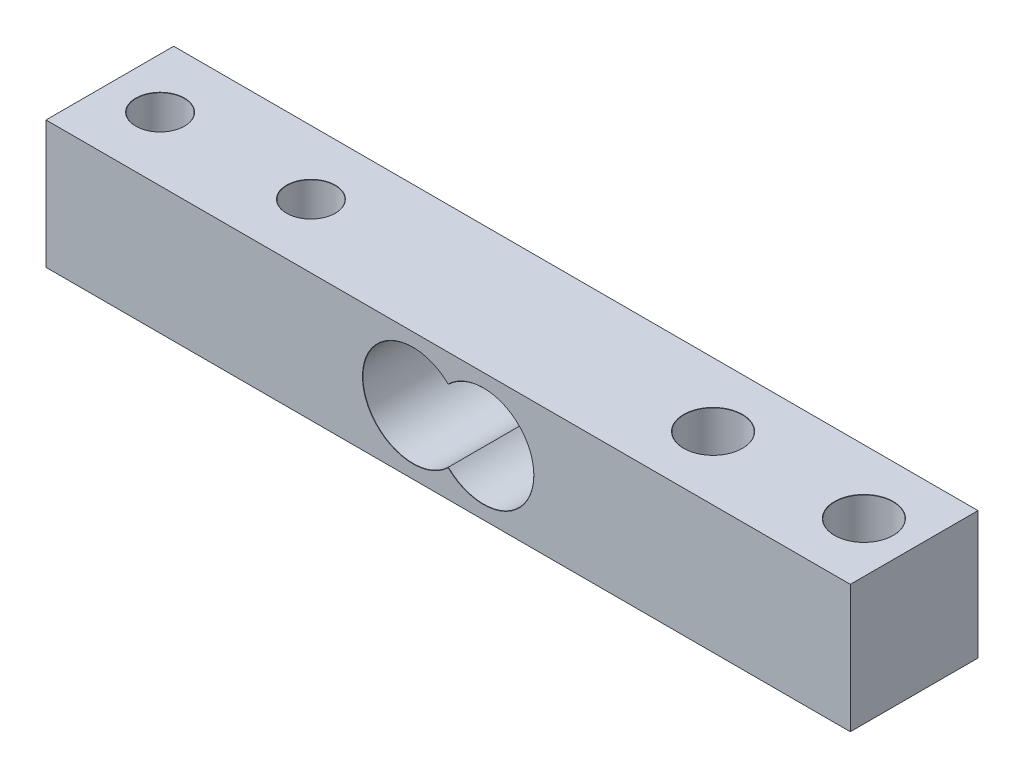
ISO-10303-21;
HEADER;
FILE_DESCRIPTION(('STEP AP214'),'2;1');
FILE_NAME('part.step','',(''),(''),'','','');
FILE_SCHEMA(('AUTOMOTIVE_DESIGN { 1 0 10303 214 1 1 1 1 }'));
ENDSEC;
DATA;
#1=APPLICATION_CONTEXT('core data for automotive mechanical design processes');
#2=APPLICATION_PROTOCOL_DEFINITION('international standard','automotive_design',2000,#1);
#3=PRODUCT_CONTEXT('',#1,'mechanical');
#4=PRODUCT('Part','Part','',(#3));
#5=PRODUCT_RELATED_PRODUCT_CATEGORY('part','',(#4));
#6=PRODUCT_DEFINITION_FORMATION('','',#4);
#7=PRODUCT_DEFINITION_CONTEXT('part definition',#1,'design');
#8=PRODUCT_DEFINITION('design','',#6,#7);
#9=PRODUCT_DEFINITION_SHAPE('','',#8);
#10=(LENGTH_UNIT() NAMED_UNIT(*) SI_UNIT(.MILLI.,.METRE.));
#11=(NAMED_UNIT(*) PLANE_ANGLE_UNIT() SI_UNIT($,.RADIAN.));
#12=(NAMED_UNIT(*) SI_UNIT($,.STERADIAN.) SOLID_ANGLE_UNIT());
#13=UNCERTAINTY_MEASURE_WITH_UNIT(LENGTH_MEASURE(1.E-05),#10,'distance_accuracy_value','');
#14=(GEOMETRIC_REPRESENTATION_CONTEXT(3) GLOBAL_UNCERTAINTY_ASSIGNED_CONTEXT((#13)) GLOBAL_UNIT_ASSIGNED_CONTEXT((#10,
#11,#12)) REPRESENTATION_CONTEXT('',''));
#15=CARTESIAN_POINT('',(0.,0.,0.));
#16=DIRECTION('',(0.,0.,1.));
#17=DIRECTION('',(1.,0.,0.));
#18=AXIS2_PLACEMENT_3D('',#15,#16,#17);
#19=CARTESIAN_POINT('',(40.,12.7,6.35));
#20=DIRECTION('',(-1.,0.,0.));
#21=DIRECTION('',(0.,0.,1.));
#22=AXIS2_PLACEMENT_3D('',#19,#20,#21);
#23=PLANE('',#22);
#24=DIRECTION('',(0.,0.,-1.));
#25=VECTOR('',#24,1.);
#26=CARTESIAN_POINT('',(40.,0.,6.35));
#27=LINE('',#26,#25);
#28=CARTESIAN_POINT('',(40.,0.,6.35));
#29=VERTEX_POINT('',#28);
#30=CARTESIAN_POINT('',(40.,0.,-6.35));
#31=VERTEX_POINT('',#30);
#32=EDGE_CURVE('E171',#29,#31,#27,.T.);
#33=ORIENTED_EDGE('',*,*,#32,.T.);
#34=DIRECTION('',(0.,-1.,0.));
#35=VECTOR('',#34,1.);
#36=CARTESIAN_POINT('',(40.,12.7,-6.35));
#37=LINE('',#36,#35);
#38=CARTESIAN_POINT('',(40.,12.7,-6.35));
#39=VERTEX_POINT('',#38);
#40=EDGE_CURVE('E203',#39,#31,#37,.T.);
#41=ORIENTED_EDGE('',*,*,#40,.F.);
#42=DIRECTION('',(0.,0.,-1.));
#43=VECTOR('',#42,1.);
#44=CARTESIAN_POINT('',(40.,12.7,6.35));
#45=LINE('',#44,#43);
#46=CARTESIAN_POINT('',(40.,12.7,6.35));
#47=VERTEX_POINT('',#46);
#48=EDGE_CURVE('E172',#47,#39,#45,.T.);
#49=ORIENTED_EDGE('',*,*,#48,.F.);
#50=DIRECTION('',(0.,-1.,0.));
#51=VECTOR('',#50,1.);
#52=CARTESIAN_POINT('',(40.,12.7,6.35));
#53=LINE('',#52,#51);
#54=EDGE_CURVE('E182',#47,#29,#53,.T.);
#55=ORIENTED_EDGE('',*,*,#54,.T.);
#56=EDGE_LOOP('',(#33,#41,#49,#55));
#57=FACE_BOUND('',#56,.T.);
#58=ADVANCED_FACE('F43',(#57),#23,.F.);
#59=CARTESIAN_POINT('',(-40.,12.7,-6.35));
#60=DIRECTION('',(0.,0.,1.));
#61=DIRECTION('',(1.,0.,0.));
#62=AXIS2_PLACEMENT_3D('',#59,#60,#61);
#63=PLANE('',#62);
#64=CARTESIAN_POINT('',(3.5,6.35,-6.35));
#65=DIRECTION('',(0.,0.,1.));
#66=DIRECTION('',(1.,0.,0.));
#67=AXIS2_PLACEMENT_3D('',#64,#65,#66);
#68=CIRCLE('',#67,5.);
#69=CARTESIAN_POINT('',(0.,2.77928578572858,-6.35));
#70=VERTEX_POINT('',#69);
#71=CARTESIAN_POINT('',(0.,9.92071421427142,-6.35));
#72=VERTEX_POINT('',#71);
#73=EDGE_CURVE('E139',#70,#72,#68,.T.);
#74=ORIENTED_EDGE('',*,*,#73,.T.);
#75=CARTESIAN_POINT('',(-3.5,6.35,-6.35));
#76=DIRECTION('',(0.,0.,1.));
#77=DIRECTION('',(1.,0.,0.));
#78=AXIS2_PLACEMENT_3D('',#75,#76,#77);
#79=CIRCLE('',#78,5.);
#80=EDGE_CURVE('E116',#72,#70,#79,.T.);
#81=ORIENTED_EDGE('',*,*,#80,.T.);
#82=EDGE_LOOP('',(#74,#81));
#83=FACE_BOUND('',#82,.T.);
#84=DIRECTION('',(-1.,0.,0.));
#85=VECTOR('',#84,1.);
#86=CARTESIAN_POINT('',(-40.,0.,-6.35));
#87=LINE('',#86,#85);
#88=CARTESIAN_POINT('',(-40.,0.,-6.35));
#89=VERTEX_POINT('',#88);
#90=EDGE_CURVE('E186',#31,#89,#87,.T.);
#91=ORIENTED_EDGE('',*,*,#90,.T.);
#92=DIRECTION('',(0.,-1.,0.));
#93=VECTOR('',#92,1.);
#94=CARTESIAN_POINT('',(-40.,12.7,-6.35));
#95=LINE('',#94,#93);
#96=CARTESIAN_POINT('',(-40.,12.7,-6.35));
#97=VERTEX_POINT('',#96);
#98=EDGE_CURVE('E199',#97,#89,#95,.T.);
#99=ORIENTED_EDGE('',*,*,#98,.F.);
#100=DIRECTION('',(-1.,0.,0.));
#101=VECTOR('',#100,1.);
#102=CARTESIAN_POINT('',(-40.,12.7,-6.35));
#103=LINE('',#102,#101);
#104=EDGE_CURVE('E96',#39,#97,#103,.T.);
#105=ORIENTED_EDGE('',*,*,#104,.F.);
#106=ORIENTED_EDGE('',*,*,#40,.T.);
#107=EDGE_LOOP('',(#91,#99,#105,#106));
#108=FACE_BOUND('',#107,.T.);
#109=ADVANCED_FACE('F231',(#83,#108),#63,.F.);
#110=CARTESIAN_POINT('',(-40.,12.7,6.35));
#111=DIRECTION('',(1.,0.,0.));
#112=DIRECTION('',(0.,0.,-1.));
#113=AXIS2_PLACEMENT_3D('',#110,#111,#112);
#114=PLANE('',#113);
#115=DIRECTION('',(0.,0.,1.));
#116=VECTOR('',#115,1.);
#117=CARTESIAN_POINT('',(-40.,0.,6.35));
#118=LINE('',#117,#116);
#119=CARTESIAN_POINT('',(-40.,0.,6.35));
#120=VERTEX_POINT('',#119);
#121=EDGE_CURVE('E189',#89,#120,#118,.T.);
#122=ORIENTED_EDGE('',*,*,#121,.T.);
#123=DIRECTION('',(0.,-1.,0.));
#124=VECTOR('',#123,1.);
#125=CARTESIAN_POINT('',(-40.,12.7,6.35));
#126=LINE('',#125,#124);
#127=CARTESIAN_POINT('',(-40.,12.7,6.35));
#128=VERTEX_POINT('',#127);
#129=EDGE_CURVE('E196',#128,#120,#126,.T.);
#130=ORIENTED_EDGE('',*,*,#129,.F.);
#131=DIRECTION('',(0.,0.,1.));
#132=VECTOR('',#131,1.);
#133=CARTESIAN_POINT('',(-40.,12.7,6.35));
#134=LINE('',#133,#132);
#135=EDGE_CURVE('E177',#97,#128,#134,.T.);
#136=ORIENTED_EDGE('',*,*,#135,.F.);
#137=ORIENTED_EDGE('',*,*,#98,.T.);
#138=EDGE_LOOP('',(#122,#130,#136,#137));
#139=FACE_BOUND('',#138,.T.);
#140=ADVANCED_FACE('F236',(#139),#114,.F.);
#141=CARTESIAN_POINT('',(-40.,12.7,6.35));
#142=DIRECTION('',(0.,0.,-1.));
#143=DIRECTION('',(-1.,0.,0.));
#144=AXIS2_PLACEMENT_3D('',#141,#142,#143);
#145=PLANE('',#144);
#146=CARTESIAN_POINT('',(3.5,6.35,6.35));
#147=DIRECTION('',(0.,0.,1.));
#148=DIRECTION('',(1.,0.,0.));
#149=AXIS2_PLACEMENT_3D('',#146,#147,#148);
#150=CIRCLE('',#149,5.025);
#151=CARTESIAN_POINT('',(0.,2.74436205367205,6.35));
#152=VERTEX_POINT('',#151);
#153=CARTESIAN_POINT('',(0.,9.95563794632795,6.35));
#154=VERTEX_POINT('',#153);
#155=EDGE_CURVE('E134',#152,#154,#150,.T.);
#156=ORIENTED_EDGE('',*,*,#155,.F.);
#157=CARTESIAN_POINT('',(-3.5,6.35,6.35));
#158=DIRECTION('',(0.,0.,1.));
#159=DIRECTION('',(1.,0.,0.));
#160=AXIS2_PLACEMENT_3D('',#157,#158,#159);
#161=CIRCLE('',#160,5.025);
#162=EDGE_CURVE('E58',#154,#152,#161,.T.);
#163=ORIENTED_EDGE('',*,*,#162,.F.);
#164=EDGE_LOOP('',(#156,#163));
#165=FACE_BOUND('',#164,.T.);
#166=DIRECTION('',(1.,0.,0.));
#167=VECTOR('',#166,1.);
#168=CARTESIAN_POINT('',(-40.,0.,6.35));
#169=LINE('',#168,#167);
#170=EDGE_CURVE('E88',#120,#29,#169,.T.);
#171=ORIENTED_EDGE('',*,*,#170,.T.);
#172=ORIENTED_EDGE('',*,*,#54,.F.);
#173=DIRECTION('',(1.,0.,0.));
#174=VECTOR('',#173,1.);
#175=CARTESIAN_POINT('',(-40.,12.7,6.35));
#176=LINE('',#175,#174);
#177=EDGE_CURVE('E67',#128,#47,#176,.T.);
#178=ORIENTED_EDGE('',*,*,#177,.F.);
#179=ORIENTED_EDGE('',*,*,#129,.T.);
#180=EDGE_LOOP('',(#171,#172,#178,#179));
#181=FACE_BOUND('',#180,.T.);
#182=ADVANCED_FACE('F249',(#165,#181),#145,.F.);
#183=CARTESIAN_POINT('',(0.,12.7,0.));
#184=DIRECTION('',(0.,-1.,0.));
#185=DIRECTION('',(0.,0.,-1.));
#186=AXIS2_PLACEMENT_3D('',#183,#184,#185);
#187=PLANE('',#186);
#188=CARTESIAN_POINT('',(35.,12.7,0.));
#189=DIRECTION('',(0.,1.,0.));
#190=DIRECTION('',(0.,0.,1.));
#191=AXIS2_PLACEMENT_3D('',#188,#189,#190);
#192=CIRCLE('',#191,2.925);
#193=CARTESIAN_POINT('',(35.,12.7,2.925));
#194=VERTEX_POINT('',#193);
#195=EDGE_CURVE('E451',#194,#194,#192,.T.);
#196=ORIENTED_EDGE('',*,*,#195,.F.);
#197=EDGE_LOOP('',(#196));
#198=FACE_BOUND('',#197,.T.);
#199=CARTESIAN_POINT('',(20.,12.7,0.));
#200=DIRECTION('',(0.,1.,0.));
#201=DIRECTION('',(0.,0.,1.));
#202=AXIS2_PLACEMENT_3D('',#199,#200,#201);
#203=CIRCLE('',#202,2.925);
#204=CARTESIAN_POINT('',(20.,12.7,2.92499999999999));
#205=VERTEX_POINT('',#204);
#206=EDGE_CURVE('E461',#205,#205,#203,.T.);
#207=ORIENTED_EDGE('',*,*,#206,.F.);
#208=EDGE_LOOP('',(#207));
#209=FACE_BOUND('',#208,.T.);
#210=CARTESIAN_POINT('',(-35.,12.7,0.));
#211=DIRECTION('',(0.,1.,0.));
#212=DIRECTION('',(0.,0.,1.));
#213=AXIS2_PLACEMENT_3D('',#210,#211,#212);
#214=CIRCLE('',#213,2.425);
#215=CARTESIAN_POINT('',(-35.,12.7,2.425));
#216=VERTEX_POINT('',#215);
#217=EDGE_CURVE('E143',#216,#216,#214,.T.);
#218=ORIENTED_EDGE('',*,*,#217,.F.);
#219=EDGE_LOOP('',(#218));
#220=FACE_BOUND('',#219,.T.);
#221=CARTESIAN_POINT('',(-20.,12.7,0.));
#222=DIRECTION('',(0.,1.,0.));
#223=DIRECTION('',(0.,0.,1.));
#224=AXIS2_PLACEMENT_3D('',#221,#222,#223);
#225=CIRCLE('',#224,2.425);
#226=CARTESIAN_POINT('',(-20.,12.7,2.425));
#227=VERTEX_POINT('',#226);
#228=EDGE_CURVE('E159',#227,#227,#225,.T.);
#229=ORIENTED_EDGE('',*,*,#228,.F.);
#230=EDGE_LOOP('',(#229));
#231=FACE_BOUND('',#230,.T.);
#232=ORIENTED_EDGE('',*,*,#48,.T.);
#233=ORIENTED_EDGE('',*,*,#104,.T.);
#234=ORIENTED_EDGE('',*,*,#135,.T.);
#235=ORIENTED_EDGE('',*,*,#177,.T.);
#236=EDGE_LOOP('',(#232,#233,#234,#235));
#237=FACE_BOUND('',#236,.T.);
#238=ADVANCED_FACE('F247',(#198,#209,#220,#231,#237),#187,.F.);
#239=CARTESIAN_POINT('',(0.,0.,0.));
#240=DIRECTION('',(0.,-1.,0.));
#241=DIRECTION('',(0.,0.,-1.));
#242=AXIS2_PLACEMENT_3D('',#239,#240,#241);
#243=PLANE('',#242);
#244=CARTESIAN_POINT('',(35.,0.,0.));
#245=DIRECTION('',(0.,1.,0.));
#246=DIRECTION('',(0.,0.,1.));
#247=AXIS2_PLACEMENT_3D('',#244,#245,#246);
#248=CIRCLE('',#247,2.9);
#249=CARTESIAN_POINT('',(35.,0.,2.9));
#250=VERTEX_POINT('',#249);
#251=EDGE_CURVE('E455',#250,#250,#248,.T.);
#252=ORIENTED_EDGE('',*,*,#251,.T.);
#253=EDGE_LOOP('',(#252));
#254=FACE_BOUND('',#253,.T.);
#255=CARTESIAN_POINT('',(20.,0.,0.));
#256=DIRECTION('',(0.,1.,0.));
#257=DIRECTION('',(0.,0.,1.));
#258=AXIS2_PLACEMENT_3D('',#255,#256,#257);
#259=CIRCLE('',#258,2.9);
#260=CARTESIAN_POINT('',(20.,0.,2.89999999999999));
#261=VERTEX_POINT('',#260);
#262=EDGE_CURVE('E469',#261,#261,#259,.T.);
#263=ORIENTED_EDGE('',*,*,#262,.T.);
#264=EDGE_LOOP('',(#263));
#265=FACE_BOUND('',#264,.T.);
#266=CARTESIAN_POINT('',(-35.,0.,0.));
#267=DIRECTION('',(0.,1.,0.));
#268=DIRECTION('',(0.,0.,1.));
#269=AXIS2_PLACEMENT_3D('',#266,#267,#268);
#270=CIRCLE('',#269,2.4);
#271=CARTESIAN_POINT('',(-35.,0.,2.4));
#272=VERTEX_POINT('',#271);
#273=EDGE_CURVE('E155',#272,#272,#270,.T.);
#274=ORIENTED_EDGE('',*,*,#273,.T.);
#275=EDGE_LOOP('',(#274));
#276=FACE_BOUND('',#275,.T.);
#277=CARTESIAN_POINT('',(-20.,0.,0.));
#278=DIRECTION('',(0.,1.,0.));
#279=DIRECTION('',(0.,0.,1.));
#280=AXIS2_PLACEMENT_3D('',#277,#278,#279);
#281=CIRCLE('',#280,2.4);
#282=CARTESIAN_POINT('',(-20.,0.,2.4));
#283=VERTEX_POINT('',#282);
#284=EDGE_CURVE('E167',#283,#283,#281,.T.);
#285=ORIENTED_EDGE('',*,*,#284,.T.);
#286=EDGE_LOOP('',(#285));
#287=FACE_BOUND('',#286,.T.);
#288=ORIENTED_EDGE('',*,*,#32,.F.);
#289=ORIENTED_EDGE('',*,*,#170,.F.);
#290=ORIENTED_EDGE('',*,*,#121,.F.);
#291=ORIENTED_EDGE('',*,*,#90,.F.);
#292=EDGE_LOOP('',(#288,#289,#290,#291));
#293=FACE_BOUND('',#292,.T.);
#294=ADVANCED_FACE('F242',(#254,#265,#276,#287,#293),#243,.T.);
#295=CARTESIAN_POINT('',(-20.,12.7,0.));
#296=DIRECTION('',(0.,1.,0.));
#297=DIRECTION('',(0.,0.,1.));
#298=AXIS2_PLACEMENT_3D('',#295,#296,#297);
#299=CYLINDRICAL_SURFACE('',#298,2.4);
#300=ORIENTED_EDGE('',*,*,#284,.F.);
#301=EDGE_LOOP('',(#300));
#302=FACE_BOUND('',#301,.T.);
#303=CARTESIAN_POINT('',(-20.,12.6790225092206,0.));
#304=DIRECTION('',(0.,1.,0.));
#305=DIRECTION('',(0.,0.,1.));
#306=AXIS2_PLACEMENT_3D('',#303,#304,#305);
#307=CIRCLE('',#306,2.4);
#308=CARTESIAN_POINT('',(-20.,12.6790225092206,2.4));
#309=VERTEX_POINT('',#308);
#310=EDGE_CURVE('E163',#309,#309,#307,.T.);
#311=ORIENTED_EDGE('',*,*,#310,.T.);
#312=EDGE_LOOP('',(#311));
#313=FACE_BOUND('',#312,.T.);
#314=ADVANCED_FACE('F256',(#302,#313),#299,.F.);
#315=CARTESIAN_POINT('',(-20.,12.7,0.));
#316=DIRECTION('',(0.,1.,0.));
#317=DIRECTION('',(0.,0.,1.));
#318=AXIS2_PLACEMENT_3D('',#315,#316,#317);
#319=CONICAL_SURFACE('',#318,2.425,0.872664625997118);
#320=ORIENTED_EDGE('',*,*,#310,.F.);
#321=EDGE_LOOP('',(#320));
#322=FACE_BOUND('',#321,.T.);
#323=ORIENTED_EDGE('',*,*,#228,.T.);
#324=EDGE_LOOP('',(#323));
#325=FACE_BOUND('',#324,.T.);
#326=ADVANCED_FACE('F389',(#322,#325),#319,.F.);
#327=CARTESIAN_POINT('',(-35.,12.7,0.));
#328=DIRECTION('',(0.,1.,0.));
#329=DIRECTION('',(0.,0.,1.));
#330=AXIS2_PLACEMENT_3D('',#327,#328,#329);
#331=CYLINDRICAL_SURFACE('',#330,2.4);
#332=ORIENTED_EDGE('',*,*,#273,.F.);
#333=EDGE_LOOP('',(#332));
#334=FACE_BOUND('',#333,.T.);
#335=CARTESIAN_POINT('',(-35.,12.6790225092206,0.));
#336=DIRECTION('',(0.,1.,0.));
#337=DIRECTION('',(0.,0.,1.));
#338=AXIS2_PLACEMENT_3D('',#335,#336,#337);
#339=CIRCLE('',#338,2.4);
#340=CARTESIAN_POINT('',(-35.,12.6790225092206,2.4));
#341=VERTEX_POINT('',#340);
#342=EDGE_CURVE('E151',#341,#341,#339,.T.);
#343=ORIENTED_EDGE('',*,*,#342,.T.);
#344=EDGE_LOOP('',(#343));
#345=FACE_BOUND('',#344,.T.);
#346=ADVANCED_FACE('F380',(#334,#345),#331,.F.);
#347=CARTESIAN_POINT('',(-35.,12.7,0.));
#348=DIRECTION('',(0.,1.,0.));
#349=DIRECTION('',(0.,0.,1.));
#350=AXIS2_PLACEMENT_3D('',#347,#348,#349);
#351=CONICAL_SURFACE('',#350,2.425,0.87266462599705);
#352=ORIENTED_EDGE('',*,*,#342,.F.);
#353=EDGE_LOOP('',(#352));
#354=FACE_BOUND('',#353,.T.);
#355=ORIENTED_EDGE('',*,*,#217,.T.);
#356=EDGE_LOOP('',(#355));
#357=FACE_BOUND('',#356,.T.);
#358=ADVANCED_FACE('F290',(#354,#357),#351,.F.);
#359=CARTESIAN_POINT('',(3.5,6.35,6.35));
#360=DIRECTION('',(0.,0.,1.));
#361=DIRECTION('',(1.,0.,0.));
#362=AXIS2_PLACEMENT_3D('',#359,#360,#361);
#363=CYLINDRICAL_SURFACE('',#362,5.);
#364=ORIENTED_EDGE('',*,*,#73,.F.);
#365=DIRECTION('',(0.,0.,1.));
#366=VECTOR('',#365,1.);
#367=CARTESIAN_POINT('',(0.,2.77928578572858,-0.0104887453897182));
#368=LINE('',#367,#366);
#369=CARTESIAN_POINT('',(0.,2.77928578572858,6.32902250922056));
#370=VERTEX_POINT('',#369);
#371=EDGE_CURVE('E11',#70,#370,#368,.T.);
#372=ORIENTED_EDGE('',*,*,#371,.T.);
#373=CARTESIAN_POINT('',(3.5,6.35,6.32902250922056));
#374=DIRECTION('',(0.,0.,1.));
#375=DIRECTION('',(1.,0.,0.));
#376=AXIS2_PLACEMENT_3D('',#373,#374,#375);
#377=CIRCLE('',#376,5.);
#378=CARTESIAN_POINT('',(0.,9.92071421427142,6.32902250922056));
#379=VERTEX_POINT('',#378);
#380=EDGE_CURVE('E132',#370,#379,#377,.T.);
#381=ORIENTED_EDGE('',*,*,#380,.T.);
#382=DIRECTION('',(0.,0.,1.));
#383=VECTOR('',#382,1.);
#384=CARTESIAN_POINT('',(0.,9.92071421427142,-0.0104887453897182));
#385=LINE('',#384,#383);
#386=EDGE_CURVE('E51',#379,#72,#385,.F.);
#387=ORIENTED_EDGE('',*,*,#386,.T.);
#388=EDGE_LOOP('',(#364,#372,#381,#387));
#389=FACE_BOUND('',#388,.T.);
#390=ADVANCED_FACE('F137',(#389),#363,.F.);
#391=CARTESIAN_POINT('',(3.5,6.35,6.35));
#392=DIRECTION('',(0.,0.,1.));
#393=DIRECTION('',(1.,0.,0.));
#394=AXIS2_PLACEMENT_3D('',#391,#392,#393);
#395=CONICAL_SURFACE('',#394,5.025,0.872664625997152);
#396=ORIENTED_EDGE('',*,*,#155,.T.);
#397=CARTESIAN_POINT('',(0.,9.95597011656117,6.3502));
#398=CARTESIAN_POINT('',(0.,9.95004230803107,6.34663075398195));
#399=CARTESIAN_POINT('',(0.,9.94411259812668,6.34306467340926));
#400=CARTESIAN_POINT('',(0.,9.93224937556076,6.33593884314944));
#401=CARTESIAN_POINT('',(0.,9.92631586289921,6.33237909346232));
#402=CARTESIAN_POINT('',(0.,9.92038044886338,6.32882250922057));
#403=B_SPLINE_CURVE_WITH_KNOTS('',3,(#397,#398,#399,#400,#401,#402),.UNSPECIFIED.,.F.,.F.,(4,2,
4),(0.,0.0207582636993012,0.0415165274286483),.UNSPECIFIED.);
#404=EDGE_CURVE('E122',#154,#379,#403,.T.);
#405=ORIENTED_EDGE('',*,*,#404,.T.);
#406=ORIENTED_EDGE('',*,*,#380,.F.);
#407=CARTESIAN_POINT('',(0.,2.77961955113662,6.32882250922056));
#408=CARTESIAN_POINT('',(0.,2.77368413710079,6.33237909346232));
#409=CARTESIAN_POINT('',(0.,2.76775062443924,6.33593884314944));
#410=CARTESIAN_POINT('',(0.,2.75588740187332,6.34306467340926));
#411=CARTESIAN_POINT('',(0.,2.74995769196893,6.34663075398195));
#412=CARTESIAN_POINT('',(0.,2.74402988343883,6.3502));
#413=B_SPLINE_CURVE_WITH_KNOTS('',3,(#407,#408,#409,#410,#411,#412),.UNSPECIFIED.,.F.,.F.,(4,2,
4),(0.,0.0207582637293475,0.0415165274286479),.UNSPECIFIED.);
#414=EDGE_CURVE('E125',#370,#152,#413,.T.);
#415=ORIENTED_EDGE('',*,*,#414,.T.);
#416=EDGE_LOOP('',(#396,#405,#406,#415));
#417=FACE_BOUND('',#416,.T.);
#418=ADVANCED_FACE('F131',(#417),#395,.F.);
#419=CARTESIAN_POINT('',(-3.5,6.35,6.35));
#420=DIRECTION('',(0.,0.,1.));
#421=DIRECTION('',(1.,0.,0.));
#422=AXIS2_PLACEMENT_3D('',#419,#420,#421);
#423=CYLINDRICAL_SURFACE('',#422,5.);
#424=ORIENTED_EDGE('',*,*,#80,.F.);
#425=ORIENTED_EDGE('',*,*,#386,.F.);
#426=CARTESIAN_POINT('',(-3.5,6.35,6.32902250922056));
#427=DIRECTION('',(0.,0.,1.));
#428=DIRECTION('',(1.,0.,0.));
#429=AXIS2_PLACEMENT_3D('',#426,#427,#428);
#430=CIRCLE('',#429,5.);
#431=EDGE_CURVE('E114',#379,#370,#430,.T.);
#432=ORIENTED_EDGE('',*,*,#431,.T.);
#433=ORIENTED_EDGE('',*,*,#371,.F.);
#434=EDGE_LOOP('',(#424,#425,#432,#433));
#435=FACE_BOUND('',#434,.T.);
#436=ADVANCED_FACE('F113',(#435),#423,.F.);
#437=CARTESIAN_POINT('',(-3.5,6.35,6.35));
#438=DIRECTION('',(0.,0.,1.));
#439=DIRECTION('',(1.,0.,0.));
#440=AXIS2_PLACEMENT_3D('',#437,#438,#439);
#441=CONICAL_SURFACE('',#440,5.025,0.872664625997152);
#442=ORIENTED_EDGE('',*,*,#162,.T.);
#443=ORIENTED_EDGE('',*,*,#414,.F.);
#444=ORIENTED_EDGE('',*,*,#431,.F.);
#445=ORIENTED_EDGE('',*,*,#404,.F.);
#446=EDGE_LOOP('',(#442,#443,#444,#445));
#447=FACE_BOUND('',#446,.T.);
#448=ADVANCED_FACE('F124',(#447),#441,.F.);
#449=CARTESIAN_POINT('',(20.,12.7,0.));
#450=DIRECTION('',(0.,1.,0.));
#451=DIRECTION('',(0.,0.,1.));
#452=AXIS2_PLACEMENT_3D('',#449,#450,#451);
#453=CYLINDRICAL_SURFACE('',#452,2.9);
#454=ORIENTED_EDGE('',*,*,#262,.F.);
#455=EDGE_LOOP('',(#454));
#456=FACE_BOUND('',#455,.T.);
#457=CARTESIAN_POINT('',(20.,12.6790225092206,0.));
#458=DIRECTION('',(0.,1.,0.));
#459=DIRECTION('',(0.,0.,1.));
#460=AXIS2_PLACEMENT_3D('',#457,#458,#459);
#461=CIRCLE('',#460,2.9);
#462=CARTESIAN_POINT('',(20.,12.6790225092206,2.89999999999999));
#463=VERTEX_POINT('',#462);
#464=EDGE_CURVE('E465',#463,#463,#461,.T.);
#465=ORIENTED_EDGE('',*,*,#464,.T.);
#466=EDGE_LOOP('',(#465));
#467=FACE_BOUND('',#466,.T.);
#468=ADVANCED_FACE('F223',(#456,#467),#453,.F.);
#469=CARTESIAN_POINT('',(20.,12.7,0.));
#470=DIRECTION('',(0.,1.,0.));
#471=DIRECTION('',(0.,0.,1.));
#472=AXIS2_PLACEMENT_3D('',#469,#470,#471);
#473=CONICAL_SURFACE('',#472,2.925,0.872664625997077);
#474=ORIENTED_EDGE('',*,*,#464,.F.);
#475=EDGE_LOOP('',(#474));
#476=FACE_BOUND('',#475,.T.);
#477=ORIENTED_EDGE('',*,*,#206,.T.);
#478=EDGE_LOOP('',(#477));
#479=FACE_BOUND('',#478,.T.);
#480=ADVANCED_FACE('F333',(#476,#479),#473,.F.);
#481=CARTESIAN_POINT('',(35.,12.7,0.));
#482=DIRECTION('',(0.,1.,0.));
#483=DIRECTION('',(0.,0.,1.));
#484=AXIS2_PLACEMENT_3D('',#481,#482,#483);
#485=CYLINDRICAL_SURFACE('',#484,2.9);
#486=ORIENTED_EDGE('',*,*,#251,.F.);
#487=EDGE_LOOP('',(#486));
#488=FACE_BOUND('',#487,.T.);
#489=CARTESIAN_POINT('',(35.,12.6790225092206,0.));
#490=DIRECTION('',(0.,1.,0.));
#491=DIRECTION('',(0.,0.,1.));
#492=AXIS2_PLACEMENT_3D('',#489,#490,#491);
#493=CIRCLE('',#492,2.9);
#494=CARTESIAN_POINT('',(35.,12.6790225092206,2.9));
#495=VERTEX_POINT('',#494);
#496=EDGE_CURVE('E449',#495,#495,#493,.T.);
#497=ORIENTED_EDGE('',*,*,#496,.T.);
#498=EDGE_LOOP('',(#497));
#499=FACE_BOUND('',#498,.T.);
#500=ADVANCED_FACE('F343',(#488,#499),#485,.F.);
#501=CARTESIAN_POINT('',(35.,12.7,0.));
#502=DIRECTION('',(0.,1.,0.));
#503=DIRECTION('',(0.,0.,1.));
#504=AXIS2_PLACEMENT_3D('',#501,#502,#503);
#505=CONICAL_SURFACE('',#504,2.925,0.872664625997009);
#506=ORIENTED_EDGE('',*,*,#496,.F.);
#507=EDGE_LOOP('',(#506));
#508=FACE_BOUND('',#507,.T.);
#509=ORIENTED_EDGE('',*,*,#195,.T.);
#510=EDGE_LOOP('',(#509));
#511=FACE_BOUND('',#510,.T.);
#512=ADVANCED_FACE('F353',(#508,#511),#505,.F.);
#513=CLOSED_SHELL('',(#58,#109,#140,#182,#238,#294,#314,#326,#346,#358,#390,#418,#436,#448,#468,
#480,#500,#512));
#514=MANIFOLD_SOLID_BREP('B2',#513);
#515=ADVANCED_BREP_SHAPE_REPRESENTATION('',(#18,#514),#14);
#516=SHAPE_DEFINITION_REPRESENTATION(#9,#515);
ENDSEC;
END-ISO-10303-21;
